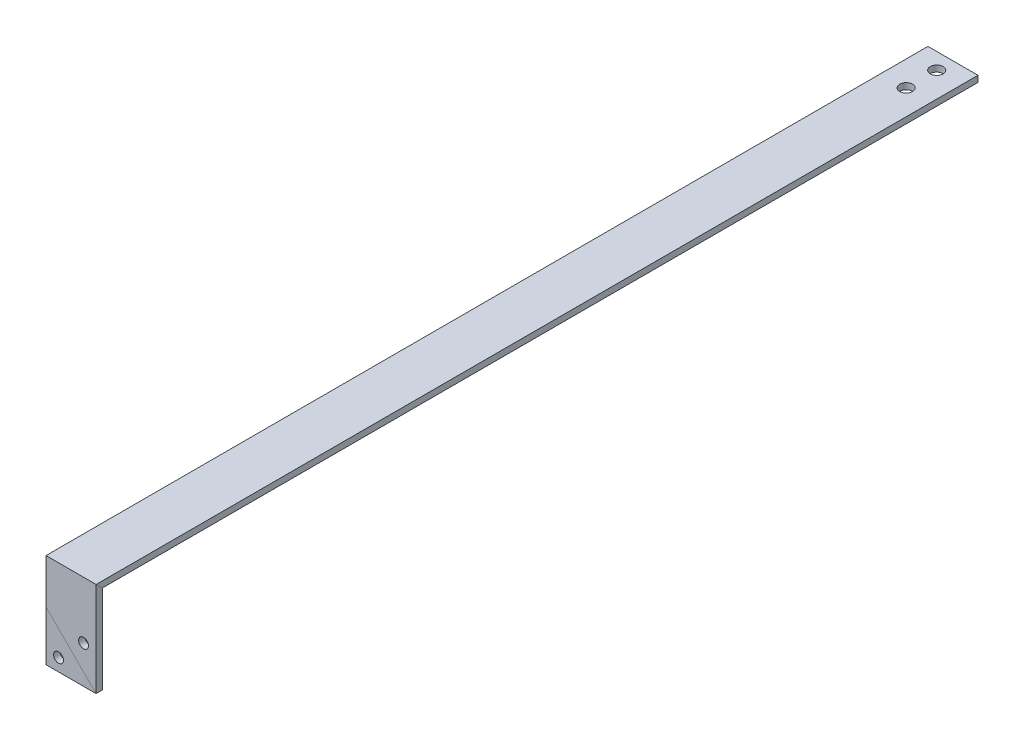
ISO-10303-21;
HEADER;
FILE_DESCRIPTION(('STEP AP214'),'2;1');
FILE_NAME('part.step','',(''),(''),'','','');
FILE_SCHEMA(('AUTOMOTIVE_DESIGN { 1 0 10303 214 1 1 1 1 }'));
ENDSEC;
DATA;
#1=APPLICATION_CONTEXT('core data for automotive mechanical design processes');
#2=APPLICATION_PROTOCOL_DEFINITION('international standard','automotive_design',2000,#1);
#3=PRODUCT_CONTEXT('',#1,'mechanical');
#4=PRODUCT('Part','Part','',(#3));
#5=PRODUCT_RELATED_PRODUCT_CATEGORY('part','',(#4));
#6=PRODUCT_DEFINITION_FORMATION('','',#4);
#7=PRODUCT_DEFINITION_CONTEXT('part definition',#1,'design');
#8=PRODUCT_DEFINITION('design','',#6,#7);
#9=PRODUCT_DEFINITION_SHAPE('','',#8);
#10=(LENGTH_UNIT() NAMED_UNIT(*) SI_UNIT(.MILLI.,.METRE.));
#11=(NAMED_UNIT(*) PLANE_ANGLE_UNIT() SI_UNIT($,.RADIAN.));
#12=(NAMED_UNIT(*) SI_UNIT($,.STERADIAN.) SOLID_ANGLE_UNIT());
#13=UNCERTAINTY_MEASURE_WITH_UNIT(LENGTH_MEASURE(1.E-05),#10,'distance_accuracy_value','');
#14=(GEOMETRIC_REPRESENTATION_CONTEXT(3) GLOBAL_UNCERTAINTY_ASSIGNED_CONTEXT((#13)) GLOBAL_UNIT_ASSIGNED_CONTEXT((#10,
#11,#12)) REPRESENTATION_CONTEXT('',''));
#15=CARTESIAN_POINT('',(0.,0.,0.));
#16=DIRECTION('',(0.,0.,1.));
#17=DIRECTION('',(1.,0.,0.));
#18=AXIS2_PLACEMENT_3D('',#15,#16,#17);
#19=CARTESIAN_POINT('',(0.,0.,0.));
#20=DIRECTION('',(0.,0.,1.));
#21=DIRECTION('',(1.,0.,0.));
#22=AXIS2_PLACEMENT_3D('',#19,#20,#21);
#23=PLANE('',#22);
#24=DIRECTION('',(0.,1.,0.));
#25=VECTOR('',#24,1.);
#26=CARTESIAN_POINT('',(25.4,3.155,0.));
#27=LINE('',#26,#25);
#28=CARTESIAN_POINT('',(25.4,-3.155,0.));
#29=VERTEX_POINT('',#28);
#30=CARTESIAN_POINT('',(25.4,3.155,0.));
#31=VERTEX_POINT('',#30);
#32=EDGE_CURVE('E139',#29,#31,#27,.T.);
#33=ORIENTED_EDGE('',*,*,#32,.F.);
#34=DIRECTION('',(1.,0.,0.));
#35=VECTOR('',#34,1.);
#36=CARTESIAN_POINT('',(-25.4,-3.155,0.));
#37=LINE('',#36,#35);
#38=CARTESIAN_POINT('',(-25.4,-3.155,0.));
#39=VERTEX_POINT('',#38);
#40=EDGE_CURVE('E143',#39,#29,#37,.T.);
#41=ORIENTED_EDGE('',*,*,#40,.F.);
#42=DIRECTION('',(0.,-1.,0.));
#43=VECTOR('',#42,1.);
#44=CARTESIAN_POINT('',(-25.4,3.155,0.));
#45=LINE('',#44,#43);
#46=CARTESIAN_POINT('',(-25.4,3.155,0.));
#47=VERTEX_POINT('',#46);
#48=EDGE_CURVE('E82',#47,#39,#45,.T.);
#49=ORIENTED_EDGE('',*,*,#48,.F.);
#50=DIRECTION('',(-1.,0.,0.));
#51=VECTOR('',#50,1.);
#52=CARTESIAN_POINT('',(-25.4,3.155,0.));
#53=LINE('',#52,#51);
#54=EDGE_CURVE('E135',#31,#47,#53,.T.);
#55=ORIENTED_EDGE('',*,*,#54,.F.);
#56=EDGE_LOOP('',(#33,#41,#49,#55));
#57=FACE_BOUND('',#56,.T.);
#58=ADVANCED_FACE('F34',(#57),#23,.F.);
#59=CARTESIAN_POINT('',(28.0399999999999,-41.98,888.575));
#60=DIRECTION('',(0.,0.,-1.));
#61=DIRECTION('',(-1.,0.,0.));
#62=AXIS2_PLACEMENT_3D('',#59,#60,#61);
#63=PLANE('',#62);
#64=CARTESIAN_POINT('',(-12.7,-80.08,888.575));
#65=DIRECTION('',(0.,0.,-1.));
#66=DIRECTION('',(-1.,0.,0.));
#67=AXIS2_PLACEMENT_3D('',#64,#65,#66);
#68=CIRCLE('',#67,5.);
#69=CARTESIAN_POINT('',(-17.7,-80.08,888.575));
#70=VERTEX_POINT('',#69);
#71=EDGE_CURVE('E249',#70,#70,#68,.T.);
#72=ORIENTED_EDGE('',*,*,#71,.F.);
#73=EDGE_LOOP('',(#72));
#74=FACE_BOUND('',#73,.T.);
#75=DIRECTION('',(0.,-1.,0.));
#76=VECTOR('',#75,1.);
#77=CARTESIAN_POINT('',(-25.4,-41.98,888.575));
#78=LINE('',#77,#76);
#79=CARTESIAN_POINT('',(-25.4,-41.98,888.575));
#80=VERTEX_POINT('',#79);
#81=CARTESIAN_POINT('',(-25.4,-92.78,888.575));
#82=VERTEX_POINT('',#81);
#83=EDGE_CURVE('E192',#80,#82,#78,.T.);
#84=ORIENTED_EDGE('',*,*,#83,.F.);
#85=DIRECTION('',(-0.707106781186548,0.707106781186548,0.));
#86=VECTOR('',#85,1.);
#87=CARTESIAN_POINT('',(-48.1752499999999,-19.2047500000001,888.575));
#88=LINE('',#87,#86);
#89=CARTESIAN_POINT('',(25.4,-92.78,888.575));
#90=VERTEX_POINT('',#89);
#91=EDGE_CURVE('E74',#90,#80,#88,.T.);
#92=ORIENTED_EDGE('',*,*,#91,.F.);
#93=DIRECTION('',(-1.,0.,0.));
#94=VECTOR('',#93,1.);
#95=CARTESIAN_POINT('',(28.04,-92.78,888.575));
#96=LINE('',#95,#94);
#97=EDGE_CURVE('E156',#90,#82,#96,.T.);
#98=ORIENTED_EDGE('',*,*,#97,.T.);
#99=EDGE_LOOP('',(#84,#92,#98));
#100=FACE_BOUND('',#99,.T.);
#101=ADVANCED_FACE('F195',(#74,#100),#63,.T.);
#102=CARTESIAN_POINT('',(28.04,-92.78,894.885));
#103=DIRECTION('',(0.,-1.,0.));
#104=DIRECTION('',(0.,0.,-1.));
#105=AXIS2_PLACEMENT_3D('',#102,#103,#104);
#106=PLANE('',#105);
#107=DIRECTION('',(0.,0.,-1.));
#108=VECTOR('',#107,1.);
#109=CARTESIAN_POINT('',(-25.4,-92.78,894.885));
#110=LINE('',#109,#108);
#111=CARTESIAN_POINT('',(-25.4,-92.78,894.885));
#112=VERTEX_POINT('',#111);
#113=EDGE_CURVE('E173',#112,#82,#110,.T.);
#114=ORIENTED_EDGE('',*,*,#113,.T.);
#115=ORIENTED_EDGE('',*,*,#97,.F.);
#116=DIRECTION('',(0.,0.,-1.));
#117=VECTOR('',#116,1.);
#118=CARTESIAN_POINT('',(25.4,-92.78,894.885));
#119=LINE('',#118,#117);
#120=CARTESIAN_POINT('',(25.4,-92.78,894.885));
#121=VERTEX_POINT('',#120);
#122=EDGE_CURVE('E66',#121,#90,#119,.T.);
#123=ORIENTED_EDGE('',*,*,#122,.F.);
#124=DIRECTION('',(-1.,0.,0.));
#125=VECTOR('',#124,1.);
#126=CARTESIAN_POINT('',(28.04,-92.78,894.885));
#127=LINE('',#126,#125);
#128=EDGE_CURVE('E159',#121,#112,#127,.T.);
#129=ORIENTED_EDGE('',*,*,#128,.T.);
#130=EDGE_LOOP('',(#114,#115,#123,#129));
#131=FACE_BOUND('',#130,.T.);
#132=ADVANCED_FACE('F194',(#131),#106,.T.);
#133=CARTESIAN_POINT('',(28.04,-41.98,894.885));
#134=DIRECTION('',(0.,0.,1.));
#135=DIRECTION('',(1.,0.,0.));
#136=AXIS2_PLACEMENT_3D('',#133,#134,#135);
#137=PLANE('',#136);
#138=CARTESIAN_POINT('',(-12.7,-80.08,894.885));
#139=DIRECTION('',(0.,0.,1.));
#140=DIRECTION('',(1.,0.,0.));
#141=AXIS2_PLACEMENT_3D('',#138,#139,#140);
#142=CIRCLE('',#141,5.);
#143=CARTESIAN_POINT('',(-7.69999999999999,-80.08,894.885));
#144=VERTEX_POINT('',#143);
#145=EDGE_CURVE('E37',#144,#144,#142,.T.);
#146=ORIENTED_EDGE('',*,*,#145,.F.);
#147=EDGE_LOOP('',(#146));
#148=FACE_BOUND('',#147,.T.);
#149=DIRECTION('',(0.,-1.,0.));
#150=VECTOR('',#149,1.);
#151=CARTESIAN_POINT('',(-25.4,-41.98,894.885));
#152=LINE('',#151,#150);
#153=CARTESIAN_POINT('',(-25.4,-41.98,894.885));
#154=VERTEX_POINT('',#153);
#155=EDGE_CURVE('E120',#154,#112,#152,.T.);
#156=ORIENTED_EDGE('',*,*,#155,.T.);
#157=ORIENTED_EDGE('',*,*,#128,.F.);
#158=DIRECTION('',(0.707106781186548,-0.707106781186548,0.));
#159=VECTOR('',#158,1.);
#160=CARTESIAN_POINT('',(-48.1752499999999,-19.2047500000001,894.885));
#161=LINE('',#160,#159);
#162=EDGE_CURVE('E122',#154,#121,#161,.T.);
#163=ORIENTED_EDGE('',*,*,#162,.F.);
#164=EDGE_LOOP('',(#156,#157,#163));
#165=FACE_BOUND('',#164,.T.);
#166=ADVANCED_FACE('F203',(#148,#165),#137,.T.);
#167=CARTESIAN_POINT('',(-25.4,3.57049999999988,894.885));
#168=DIRECTION('',(0.,0.,1.));
#169=DIRECTION('',(1.,0.,0.));
#170=AXIS2_PLACEMENT_3D('',#167,#168,#169);
#171=PLANE('',#170);
#172=CARTESIAN_POINT('',(12.7,-54.68,894.885));
#173=DIRECTION('',(0.,0.,1.));
#174=DIRECTION('',(1.,0.,0.));
#175=AXIS2_PLACEMENT_3D('',#172,#173,#174);
#176=CIRCLE('',#175,5.);
#177=CARTESIAN_POINT('',(17.7,-54.68,894.885));
#178=VERTEX_POINT('',#177);
#179=EDGE_CURVE('E193',#178,#178,#176,.T.);
#180=ORIENTED_EDGE('',*,*,#179,.F.);
#181=EDGE_LOOP('',(#180));
#182=FACE_BOUND('',#181,.T.);
#183=DIRECTION('',(0.,-1.,0.));
#184=VECTOR('',#183,1.);
#185=CARTESIAN_POINT('',(-25.4,3.57049999999988,894.885));
#186=LINE('',#185,#184);
#187=CARTESIAN_POINT('',(-25.4,3.155,894.885));
#188=VERTEX_POINT('',#187);
#189=EDGE_CURVE('E105',#188,#154,#186,.T.);
#190=ORIENTED_EDGE('',*,*,#189,.T.);
#191=ORIENTED_EDGE('',*,*,#162,.T.);
#192=DIRECTION('',(0.,-1.,0.));
#193=VECTOR('',#192,1.);
#194=CARTESIAN_POINT('',(25.4,3.57049999999988,894.885));
#195=LINE('',#194,#193);
#196=CARTESIAN_POINT('',(25.4,3.155,894.885));
#197=VERTEX_POINT('',#196);
#198=EDGE_CURVE('E107',#197,#121,#195,.T.);
#199=ORIENTED_EDGE('',*,*,#198,.F.);
#200=DIRECTION('',(1.,0.,0.));
#201=VECTOR('',#200,1.);
#202=CARTESIAN_POINT('',(-25.4,3.155,894.885));
#203=LINE('',#202,#201);
#204=EDGE_CURVE('E101',#188,#197,#203,.T.);
#205=ORIENTED_EDGE('',*,*,#204,.F.);
#206=EDGE_LOOP('',(#190,#191,#199,#205));
#207=FACE_BOUND('',#206,.T.);
#208=ADVANCED_FACE('F103',(#182,#207),#171,.T.);
#209=CARTESIAN_POINT('',(25.4,3.57049999999988,894.885));
#210=DIRECTION('',(1.,0.,0.));
#211=DIRECTION('',(0.,0.,-1.));
#212=AXIS2_PLACEMENT_3D('',#209,#210,#211);
#213=PLANE('',#212);
#214=ORIENTED_EDGE('',*,*,#198,.T.);
#215=ORIENTED_EDGE('',*,*,#122,.T.);
#216=DIRECTION('',(0.,-1.,0.));
#217=VECTOR('',#216,1.);
#218=CARTESIAN_POINT('',(25.4,3.57049999999988,888.575));
#219=LINE('',#218,#217);
#220=CARTESIAN_POINT('',(25.4,-3.15500000000007,888.575));
#221=VERTEX_POINT('',#220);
#222=EDGE_CURVE('E155',#221,#90,#219,.T.);
#223=ORIENTED_EDGE('',*,*,#222,.F.);
#224=DIRECTION('',(0.,-0.707106781186548,-0.707106781186548));
#225=VECTOR('',#224,1.);
#226=CARTESIAN_POINT('',(25.4,-444.2875,447.4425));
#227=LINE('',#226,#225);
#228=EDGE_CURVE('E43',#197,#221,#227,.T.);
#229=ORIENTED_EDGE('',*,*,#228,.F.);
#230=EDGE_LOOP('',(#214,#215,#223,#229));
#231=FACE_BOUND('',#230,.T.);
#232=ADVANCED_FACE('F188',(#231),#213,.T.);
#233=CARTESIAN_POINT('',(-25.4,3.57049999999988,888.575));
#234=DIRECTION('',(0.,0.,-1.));
#235=DIRECTION('',(-1.,0.,0.));
#236=AXIS2_PLACEMENT_3D('',#233,#234,#235);
#237=PLANE('',#236);
#238=CARTESIAN_POINT('',(12.7,-54.68,888.575));
#239=DIRECTION('',(0.,0.,-1.));
#240=DIRECTION('',(-1.,0.,0.));
#241=AXIS2_PLACEMENT_3D('',#238,#239,#240);
#242=CIRCLE('',#241,5.);
#243=CARTESIAN_POINT('',(7.7,-54.68,888.575));
#244=VERTEX_POINT('',#243);
#245=EDGE_CURVE('E241',#244,#244,#242,.T.);
#246=ORIENTED_EDGE('',*,*,#245,.F.);
#247=EDGE_LOOP('',(#246));
#248=FACE_BOUND('',#247,.T.);
#249=ORIENTED_EDGE('',*,*,#222,.T.);
#250=ORIENTED_EDGE('',*,*,#91,.T.);
#251=DIRECTION('',(0.,-1.,0.));
#252=VECTOR('',#251,1.);
#253=CARTESIAN_POINT('',(-25.4,3.57049999999988,888.575));
#254=LINE('',#253,#252);
#255=CARTESIAN_POINT('',(-25.4,-3.15500000000004,888.575));
#256=VERTEX_POINT('',#255);
#257=EDGE_CURVE('E123',#256,#80,#254,.T.);
#258=ORIENTED_EDGE('',*,*,#257,.F.);
#259=DIRECTION('',(-1.,0.,0.));
#260=VECTOR('',#259,1.);
#261=CARTESIAN_POINT('',(-25.4,-3.155,888.575));
#262=LINE('',#261,#260);
#263=EDGE_CURVE('E11',#221,#256,#262,.T.);
#264=ORIENTED_EDGE('',*,*,#263,.F.);
#265=EDGE_LOOP('',(#249,#250,#258,#264));
#266=FACE_BOUND('',#265,.T.);
#267=ADVANCED_FACE('F189',(#248,#266),#237,.T.);
#268=CARTESIAN_POINT('',(-25.4,3.57049999999988,894.885));
#269=DIRECTION('',(-1.,0.,0.));
#270=DIRECTION('',(0.,0.,1.));
#271=AXIS2_PLACEMENT_3D('',#268,#269,#270);
#272=PLANE('',#271);
#273=ORIENTED_EDGE('',*,*,#257,.T.);
#274=ORIENTED_EDGE('',*,*,#83,.T.);
#275=ORIENTED_EDGE('',*,*,#113,.F.);
#276=ORIENTED_EDGE('',*,*,#155,.F.);
#277=ORIENTED_EDGE('',*,*,#189,.F.);
#278=DIRECTION('',(0.,0.707106781186548,0.707106781186548));
#279=VECTOR('',#278,1.);
#280=CARTESIAN_POINT('',(-25.4,-444.2875,447.4425));
#281=LINE('',#280,#279);
#282=EDGE_CURVE('E112',#256,#188,#281,.T.);
#283=ORIENTED_EDGE('',*,*,#282,.F.);
#284=EDGE_LOOP('',(#273,#274,#275,#276,#277,#283));
#285=FACE_BOUND('',#284,.T.);
#286=ADVANCED_FACE('F117',(#285),#272,.T.);
#287=CARTESIAN_POINT('',(-25.4,3.155,0.));
#288=DIRECTION('',(0.,1.,0.));
#289=DIRECTION('',(0.,0.,1.));
#290=AXIS2_PLACEMENT_3D('',#287,#288,#289);
#291=PLANE('',#290);
#292=CARTESIAN_POINT('',(5.16188979989684E-12,3.155,47.5000000000011));
#293=DIRECTION('',(0.,1.,0.));
#294=DIRECTION('',(0.,0.,1.));
#295=AXIS2_PLACEMENT_3D('',#292,#293,#294);
#296=CIRCLE('',#295,6.50000000000488);
#297=CARTESIAN_POINT('',(5.16188979989684E-12,3.155,54.000000000006));
#298=VERTEX_POINT('',#297);
#299=EDGE_CURVE('E167',#298,#298,#296,.T.);
#300=ORIENTED_EDGE('',*,*,#299,.F.);
#301=EDGE_LOOP('',(#300));
#302=FACE_BOUND('',#301,.T.);
#303=CARTESIAN_POINT('',(5.0536538783927E-12,3.155,16.5000000000011));
#304=DIRECTION('',(0.,1.,0.));
#305=DIRECTION('',(0.,0.,1.));
#306=AXIS2_PLACEMENT_3D('',#303,#304,#305);
#307=CIRCLE('',#306,6.50000000000488);
#308=CARTESIAN_POINT('',(5.0536538783927E-12,3.155,23.000000000006));
#309=VERTEX_POINT('',#308);
#310=EDGE_CURVE('E164',#309,#309,#307,.T.);
#311=ORIENTED_EDGE('',*,*,#310,.F.);
#312=EDGE_LOOP('',(#311));
#313=FACE_BOUND('',#312,.T.);
#314=DIRECTION('',(0.,0.,1.));
#315=VECTOR('',#314,1.);
#316=CARTESIAN_POINT('',(-25.4,3.155,0.));
#317=LINE('',#316,#315);
#318=EDGE_CURVE('E129',#47,#188,#317,.T.);
#319=ORIENTED_EDGE('',*,*,#318,.T.);
#320=ORIENTED_EDGE('',*,*,#204,.T.);
#321=DIRECTION('',(0.,0.,1.));
#322=VECTOR('',#321,1.);
#323=CARTESIAN_POINT('',(25.4,3.155,0.));
#324=LINE('',#323,#322);
#325=EDGE_CURVE('E132',#31,#197,#324,.T.);
#326=ORIENTED_EDGE('',*,*,#325,.F.);
#327=ORIENTED_EDGE('',*,*,#54,.T.);
#328=EDGE_LOOP('',(#319,#320,#326,#327));
#329=FACE_BOUND('',#328,.T.);
#330=ADVANCED_FACE('F134',(#302,#313,#329),#291,.T.);
#331=CARTESIAN_POINT('',(25.4,3.155,0.));
#332=DIRECTION('',(1.,0.,0.));
#333=DIRECTION('',(0.,0.,-1.));
#334=AXIS2_PLACEMENT_3D('',#331,#332,#333);
#335=PLANE('',#334);
#336=ORIENTED_EDGE('',*,*,#325,.T.);
#337=ORIENTED_EDGE('',*,*,#228,.T.);
#338=DIRECTION('',(0.,0.,1.));
#339=VECTOR('',#338,1.);
#340=CARTESIAN_POINT('',(25.4,-3.155,0.));
#341=LINE('',#340,#339);
#342=EDGE_CURVE('E137',#29,#221,#341,.T.);
#343=ORIENTED_EDGE('',*,*,#342,.F.);
#344=ORIENTED_EDGE('',*,*,#32,.T.);
#345=EDGE_LOOP('',(#336,#337,#343,#344));
#346=FACE_BOUND('',#345,.T.);
#347=ADVANCED_FACE('F186',(#346),#335,.T.);
#348=CARTESIAN_POINT('',(-25.4,-3.155,0.));
#349=DIRECTION('',(0.,-1.,0.));
#350=DIRECTION('',(0.,0.,-1.));
#351=AXIS2_PLACEMENT_3D('',#348,#349,#350);
#352=PLANE('',#351);
#353=CARTESIAN_POINT('',(5.16188979989684E-12,-3.155,47.5000000000011));
#354=DIRECTION('',(0.,-1.,0.));
#355=DIRECTION('',(0.,0.,-1.));
#356=AXIS2_PLACEMENT_3D('',#353,#354,#355);
#357=CIRCLE('',#356,6.50000000000488);
#358=CARTESIAN_POINT('',(5.16188979989684E-12,-3.155,40.9999999999963));
#359=VERTEX_POINT('',#358);
#360=EDGE_CURVE('E165',#359,#359,#357,.T.);
#361=ORIENTED_EDGE('',*,*,#360,.F.);
#362=EDGE_LOOP('',(#361));
#363=FACE_BOUND('',#362,.T.);
#364=CARTESIAN_POINT('',(5.0536538783927E-12,-3.155,16.5000000000011));
#365=DIRECTION('',(0.,-1.,0.));
#366=DIRECTION('',(0.,0.,-1.));
#367=AXIS2_PLACEMENT_3D('',#364,#365,#366);
#368=CIRCLE('',#367,6.50000000000488);
#369=CARTESIAN_POINT('',(5.0536538783927E-12,-3.155,9.99999999999626));
#370=VERTEX_POINT('',#369);
#371=EDGE_CURVE('E161',#370,#370,#368,.T.);
#372=ORIENTED_EDGE('',*,*,#371,.F.);
#373=EDGE_LOOP('',(#372));
#374=FACE_BOUND('',#373,.T.);
#375=ORIENTED_EDGE('',*,*,#342,.T.);
#376=ORIENTED_EDGE('',*,*,#263,.T.);
#377=DIRECTION('',(0.,0.,1.));
#378=VECTOR('',#377,1.);
#379=CARTESIAN_POINT('',(-25.4,-3.155,0.));
#380=LINE('',#379,#378);
#381=EDGE_CURVE('E131',#39,#256,#380,.T.);
#382=ORIENTED_EDGE('',*,*,#381,.F.);
#383=ORIENTED_EDGE('',*,*,#40,.T.);
#384=EDGE_LOOP('',(#375,#376,#382,#383));
#385=FACE_BOUND('',#384,.T.);
#386=ADVANCED_FACE('F183',(#363,#374,#385),#352,.T.);
#387=CARTESIAN_POINT('',(-25.4,3.155,0.));
#388=DIRECTION('',(-1.,0.,0.));
#389=DIRECTION('',(0.,0.,1.));
#390=AXIS2_PLACEMENT_3D('',#387,#388,#389);
#391=PLANE('',#390);
#392=ORIENTED_EDGE('',*,*,#381,.T.);
#393=ORIENTED_EDGE('',*,*,#282,.T.);
#394=ORIENTED_EDGE('',*,*,#318,.F.);
#395=ORIENTED_EDGE('',*,*,#48,.T.);
#396=EDGE_LOOP('',(#392,#393,#394,#395));
#397=FACE_BOUND('',#396,.T.);
#398=ADVANCED_FACE('F128',(#397),#391,.T.);
#399=CARTESIAN_POINT('',(5.0536538783927E-12,-6.845,16.5000000000011));
#400=DIRECTION('',(0.,1.,0.));
#401=DIRECTION('',(0.,0.,1.));
#402=AXIS2_PLACEMENT_3D('',#399,#400,#401);
#403=CYLINDRICAL_SURFACE('',#402,6.50000000000488);
#404=ORIENTED_EDGE('',*,*,#371,.T.);
#405=EDGE_LOOP('',(#404));
#406=FACE_BOUND('',#405,.T.);
#407=ORIENTED_EDGE('',*,*,#310,.T.);
#408=EDGE_LOOP('',(#407));
#409=FACE_BOUND('',#408,.T.);
#410=ADVANCED_FACE('F205',(#406,#409),#403,.F.);
#411=CARTESIAN_POINT('',(5.16188979989684E-12,-6.845,47.5000000000011));
#412=DIRECTION('',(0.,1.,0.));
#413=DIRECTION('',(0.,0.,1.));
#414=AXIS2_PLACEMENT_3D('',#411,#412,#413);
#415=CYLINDRICAL_SURFACE('',#414,6.50000000000488);
#416=ORIENTED_EDGE('',*,*,#360,.T.);
#417=EDGE_LOOP('',(#416));
#418=FACE_BOUND('',#417,.T.);
#419=ORIENTED_EDGE('',*,*,#299,.T.);
#420=EDGE_LOOP('',(#419));
#421=FACE_BOUND('',#420,.T.);
#422=ADVANCED_FACE('F214',(#418,#421),#415,.F.);
#423=CARTESIAN_POINT('',(12.7,-54.68,898.575));
#424=DIRECTION('',(0.,0.,-1.));
#425=DIRECTION('',(-1.,0.,0.));
#426=AXIS2_PLACEMENT_3D('',#423,#424,#425);
#427=CYLINDRICAL_SURFACE('',#426,5.);
#428=ORIENTED_EDGE('',*,*,#179,.T.);
#429=EDGE_LOOP('',(#428));
#430=FACE_BOUND('',#429,.T.);
#431=ORIENTED_EDGE('',*,*,#245,.T.);
#432=EDGE_LOOP('',(#431));
#433=FACE_BOUND('',#432,.T.);
#434=ADVANCED_FACE('F257',(#430,#433),#427,.F.);
#435=CARTESIAN_POINT('',(-12.7,-80.08,898.575));
#436=DIRECTION('',(0.,0.,-1.));
#437=DIRECTION('',(-1.,0.,0.));
#438=AXIS2_PLACEMENT_3D('',#435,#436,#437);
#439=CYLINDRICAL_SURFACE('',#438,5.);
#440=ORIENTED_EDGE('',*,*,#145,.T.);
#441=EDGE_LOOP('',(#440));
#442=FACE_BOUND('',#441,.T.);
#443=ORIENTED_EDGE('',*,*,#71,.T.);
#444=EDGE_LOOP('',(#443));
#445=FACE_BOUND('',#444,.T.);
#446=ADVANCED_FACE('F255',(#442,#445),#439,.F.);
#447=CLOSED_SHELL('',(#58,#101,#132,#166,#208,#232,#267,#286,#330,#347,#386,#398,#410,#422,#434,#446));
#448=MANIFOLD_SOLID_BREP('B2',#447);
#449=ADVANCED_BREP_SHAPE_REPRESENTATION('',(#18,#448),#14);
#450=SHAPE_DEFINITION_REPRESENTATION(#9,#449);
ENDSEC;
END-ISO-10303-21;
